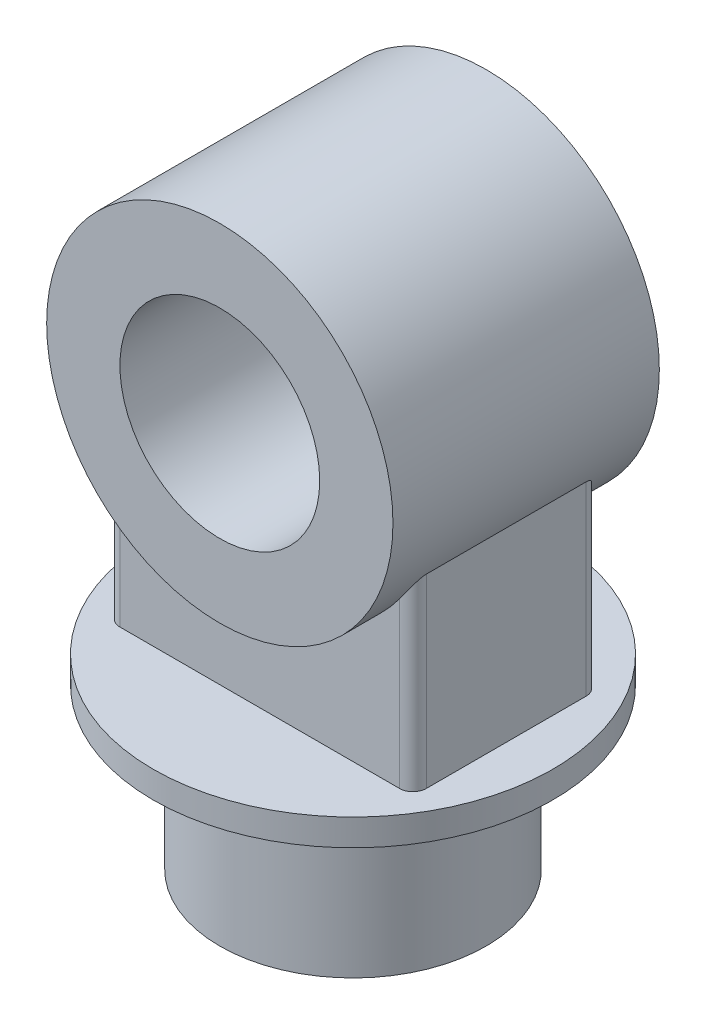
ISO-10303-21;
HEADER;
FILE_DESCRIPTION(('STEP AP214'),'2;1');
FILE_NAME('part.step','',(''),(''),'','','');
FILE_SCHEMA(('AUTOMOTIVE_DESIGN { 1 0 10303 214 1 1 1 1 }'));
ENDSEC;
DATA;
#1=APPLICATION_CONTEXT('core data for automotive mechanical design processes');
#2=APPLICATION_PROTOCOL_DEFINITION('international standard','automotive_design',2000,#1);
#3=PRODUCT_CONTEXT('',#1,'mechanical');
#4=PRODUCT('Part','Part','',(#3));
#5=PRODUCT_RELATED_PRODUCT_CATEGORY('part','',(#4));
#6=PRODUCT_DEFINITION_FORMATION('','',#4);
#7=PRODUCT_DEFINITION_CONTEXT('part definition',#1,'design');
#8=PRODUCT_DEFINITION('design','',#6,#7);
#9=PRODUCT_DEFINITION_SHAPE('','',#8);
#10=(LENGTH_UNIT() NAMED_UNIT(*) SI_UNIT(.MILLI.,.METRE.));
#11=(NAMED_UNIT(*) PLANE_ANGLE_UNIT() SI_UNIT($,.RADIAN.));
#12=(NAMED_UNIT(*) SI_UNIT($,.STERADIAN.) SOLID_ANGLE_UNIT());
#13=UNCERTAINTY_MEASURE_WITH_UNIT(LENGTH_MEASURE(1.E-05),#10,'distance_accuracy_value','');
#14=(GEOMETRIC_REPRESENTATION_CONTEXT(3) GLOBAL_UNCERTAINTY_ASSIGNED_CONTEXT((#13)) GLOBAL_UNIT_ASSIGNED_CONTEXT((#10,
#11,#12)) REPRESENTATION_CONTEXT('',''));
#15=CARTESIAN_POINT('',(0.,0.,0.));
#16=DIRECTION('',(0.,0.,1.));
#17=DIRECTION('',(1.,0.,0.));
#18=AXIS2_PLACEMENT_3D('',#15,#16,#17);
#19=CARTESIAN_POINT('',(0.,120.,0.));
#20=DIRECTION('',(0.,-1.,0.));
#21=DIRECTION('',(0.,0.,-1.));
#22=AXIS2_PLACEMENT_3D('',#19,#20,#21);
#23=CYLINDRICAL_SURFACE('',#22,100.);
#24=CARTESIAN_POINT('',(0.,120.,0.));
#25=DIRECTION('',(0.,1.,0.));
#26=DIRECTION('',(0.,0.,1.));
#27=AXIS2_PLACEMENT_3D('',#24,#25,#26);
#28=CIRCLE('',#27,100.);
#29=CARTESIAN_POINT('',(0.,120.,100.));
#30=VERTEX_POINT('',#29);
#31=EDGE_CURVE('E147',#30,#30,#28,.T.);
#32=ORIENTED_EDGE('',*,*,#31,.F.);
#33=EDGE_LOOP('',(#32));
#34=FACE_BOUND('',#33,.T.);
#35=CARTESIAN_POINT('',(0.,0.,0.));
#36=DIRECTION('',(0.,1.,0.));
#37=DIRECTION('',(0.,0.,1.));
#38=AXIS2_PLACEMENT_3D('',#35,#36,#37);
#39=CIRCLE('',#38,100.);
#40=CARTESIAN_POINT('',(0.,0.,100.));
#41=VERTEX_POINT('',#40);
#42=EDGE_CURVE('E239',#41,#41,#39,.T.);
#43=ORIENTED_EDGE('',*,*,#42,.T.);
#44=EDGE_LOOP('',(#43));
#45=FACE_BOUND('',#44,.T.);
#46=ADVANCED_FACE('F39',(#34,#45),#23,.T.);
#47=CARTESIAN_POINT('',(0.,0.,0.));
#48=DIRECTION('',(0.,1.,0.));
#49=DIRECTION('',(0.,0.,1.));
#50=AXIS2_PLACEMENT_3D('',#47,#48,#49);
#51=PLANE('',#50);
#52=ORIENTED_EDGE('',*,*,#42,.F.);
#53=EDGE_LOOP('',(#52));
#54=FACE_BOUND('',#53,.T.);
#55=ADVANCED_FACE('F251',(#54),#51,.F.);
#56=CARTESIAN_POINT('',(0.,140.,0.));
#57=DIRECTION('',(0.,-1.,0.));
#58=DIRECTION('',(0.,0.,-1.));
#59=AXIS2_PLACEMENT_3D('',#56,#57,#58);
#60=CYLINDRICAL_SURFACE('',#59,150.);
#61=CARTESIAN_POINT('',(0.,140.,0.));
#62=DIRECTION('',(0.,1.,0.));
#63=DIRECTION('',(0.,0.,1.));
#64=AXIS2_PLACEMENT_3D('',#61,#62,#63);
#65=CIRCLE('',#64,150.);
#66=CARTESIAN_POINT('',(0.,140.,150.));
#67=VERTEX_POINT('',#66);
#68=EDGE_CURVE('E235',#67,#67,#65,.T.);
#69=ORIENTED_EDGE('',*,*,#68,.F.);
#70=EDGE_LOOP('',(#69));
#71=FACE_BOUND('',#70,.T.);
#72=CARTESIAN_POINT('',(0.,120.,0.));
#73=DIRECTION('',(0.,1.,0.));
#74=DIRECTION('',(0.,0.,1.));
#75=AXIS2_PLACEMENT_3D('',#72,#73,#74);
#76=CIRCLE('',#75,150.);
#77=CARTESIAN_POINT('',(0.,120.,150.));
#78=VERTEX_POINT('',#77);
#79=EDGE_CURVE('E240',#78,#78,#76,.T.);
#80=ORIENTED_EDGE('',*,*,#79,.T.);
#81=EDGE_LOOP('',(#80));
#82=FACE_BOUND('',#81,.T.);
#83=ADVANCED_FACE('F253',(#71,#82),#60,.T.);
#84=CARTESIAN_POINT('',(0.,140.,0.));
#85=DIRECTION('',(0.,1.,0.));
#86=DIRECTION('',(0.,0.,1.));
#87=AXIS2_PLACEMENT_3D('',#84,#85,#86);
#88=PLANE('',#87);
#89=DIRECTION('',(0.,0.,-1.));
#90=VECTOR('',#89,1.);
#91=CARTESIAN_POINT('',(115.,140.,70.));
#92=LINE('',#91,#90);
#93=CARTESIAN_POINT('',(115.,140.,60.));
#94=VERTEX_POINT('',#93);
#95=CARTESIAN_POINT('',(115.,140.,-60.));
#96=VERTEX_POINT('',#95);
#97=EDGE_CURVE('E210',#94,#96,#92,.T.);
#98=ORIENTED_EDGE('',*,*,#97,.F.);
#99=CARTESIAN_POINT('',(105.,140.,60.));
#100=DIRECTION('',(0.,1.,0.));
#101=DIRECTION('',(0.,0.,1.));
#102=AXIS2_PLACEMENT_3D('',#99,#100,#101);
#103=CIRCLE('',#102,10.);
#104=CARTESIAN_POINT('',(105.,140.,70.));
#105=VERTEX_POINT('',#104);
#106=EDGE_CURVE('E54',#94,#105,#103,.F.);
#107=ORIENTED_EDGE('',*,*,#106,.T.);
#108=DIRECTION('',(1.,0.,0.));
#109=VECTOR('',#108,1.);
#110=CARTESIAN_POINT('',(-115.,140.,70.));
#111=LINE('',#110,#109);
#112=CARTESIAN_POINT('',(-105.,140.,70.));
#113=VERTEX_POINT('',#112);
#114=EDGE_CURVE('E209',#113,#105,#111,.T.);
#115=ORIENTED_EDGE('',*,*,#114,.F.);
#116=CARTESIAN_POINT('',(-105.,140.,60.));
#117=DIRECTION('',(0.,1.,0.));
#118=DIRECTION('',(0.,0.,1.));
#119=AXIS2_PLACEMENT_3D('',#116,#117,#118);
#120=CIRCLE('',#119,10.);
#121=CARTESIAN_POINT('',(-115.,140.,60.));
#122=VERTEX_POINT('',#121);
#123=EDGE_CURVE('E124',#113,#122,#120,.F.);
#124=ORIENTED_EDGE('',*,*,#123,.T.);
#125=DIRECTION('',(0.,0.,1.));
#126=VECTOR('',#125,1.);
#127=CARTESIAN_POINT('',(-115.,140.,70.));
#128=LINE('',#127,#126);
#129=CARTESIAN_POINT('',(-115.,140.,-60.));
#130=VERTEX_POINT('',#129);
#131=EDGE_CURVE('E216',#130,#122,#128,.T.);
#132=ORIENTED_EDGE('',*,*,#131,.F.);
#133=CARTESIAN_POINT('',(-105.,140.,-60.));
#134=DIRECTION('',(0.,1.,0.));
#135=DIRECTION('',(0.,0.,1.));
#136=AXIS2_PLACEMENT_3D('',#133,#134,#135);
#137=CIRCLE('',#136,10.);
#138=CARTESIAN_POINT('',(-105.,140.,-70.));
#139=VERTEX_POINT('',#138);
#140=EDGE_CURVE('E125',#130,#139,#137,.F.);
#141=ORIENTED_EDGE('',*,*,#140,.T.);
#142=DIRECTION('',(-1.,0.,0.));
#143=VECTOR('',#142,1.);
#144=CARTESIAN_POINT('',(-115.,140.,-70.));
#145=LINE('',#144,#143);
#146=CARTESIAN_POINT('',(105.,140.,-70.));
#147=VERTEX_POINT('',#146);
#148=EDGE_CURVE('E279',#147,#139,#145,.T.);
#149=ORIENTED_EDGE('',*,*,#148,.F.);
#150=CARTESIAN_POINT('',(105.,140.,-60.));
#151=DIRECTION('',(0.,1.,0.));
#152=DIRECTION('',(0.,0.,1.));
#153=AXIS2_PLACEMENT_3D('',#150,#151,#152);
#154=CIRCLE('',#153,10.);
#155=EDGE_CURVE('E61',#147,#96,#154,.F.);
#156=ORIENTED_EDGE('',*,*,#155,.T.);
#157=EDGE_LOOP('',(#98,#107,#115,#124,#132,#141,#149,#156));
#158=FACE_BOUND('',#157,.T.);
#159=ORIENTED_EDGE('',*,*,#68,.T.);
#160=EDGE_LOOP('',(#159));
#161=FACE_BOUND('',#160,.T.);
#162=ADVANCED_FACE('F207',(#158,#161),#88,.T.);
#163=CARTESIAN_POINT('',(0.,120.,0.));
#164=DIRECTION('',(0.,1.,0.));
#165=DIRECTION('',(0.,0.,1.));
#166=AXIS2_PLACEMENT_3D('',#163,#164,#165);
#167=PLANE('',#166);
#168=ORIENTED_EDGE('',*,*,#31,.T.);
#169=EDGE_LOOP('',(#168));
#170=FACE_BOUND('',#169,.T.);
#171=ORIENTED_EDGE('',*,*,#79,.F.);
#172=EDGE_LOOP('',(#171));
#173=FACE_BOUND('',#172,.T.);
#174=ADVANCED_FACE('F262',(#170,#173),#167,.F.);
#175=CARTESIAN_POINT('',(-115.,470.002,-70.));
#176=DIRECTION('',(0.,0.,1.));
#177=DIRECTION('',(1.,0.,0.));
#178=AXIS2_PLACEMENT_3D('',#175,#176,#177);
#179=PLANE('',#178);
#180=ORIENTED_EDGE('',*,*,#148,.T.);
#181=DIRECTION('',(0.,-1.,0.));
#182=VECTOR('',#181,1.);
#183=CARTESIAN_POINT('',(-105.,470.002,-70.));
#184=LINE('',#183,#182);
#185=CARTESIAN_POINT('',(-105.,263.351451416221,-70.));
#186=VERTEX_POINT('',#185);
#187=EDGE_CURVE('E145',#139,#186,#184,.F.);
#188=ORIENTED_EDGE('',*,*,#187,.T.);
#189=CARTESIAN_POINT('',(0.,340.,-70.));
#190=DIRECTION('',(0.,0.,1.));
#191=DIRECTION('',(1.,0.,0.));
#192=AXIS2_PLACEMENT_3D('',#189,#190,#191);
#193=CIRCLE('',#192,130.);
#194=CARTESIAN_POINT('',(105.,263.351451416221,-70.));
#195=VERTEX_POINT('',#194);
#196=EDGE_CURVE('E119',#195,#186,#193,.F.);
#197=ORIENTED_EDGE('',*,*,#196,.F.);
#198=DIRECTION('',(0.,-1.,0.));
#199=VECTOR('',#198,1.);
#200=CARTESIAN_POINT('',(105.,470.002,-70.));
#201=LINE('',#200,#199);
#202=EDGE_CURVE('E140',#195,#147,#201,.T.);
#203=ORIENTED_EDGE('',*,*,#202,.T.);
#204=EDGE_LOOP('',(#180,#188,#197,#203));
#205=FACE_BOUND('',#204,.T.);
#206=ADVANCED_FACE('F265',(#205),#179,.F.);
#207=CARTESIAN_POINT('',(115.,470.002,70.));
#208=DIRECTION('',(-1.,0.,0.));
#209=DIRECTION('',(0.,0.,1.));
#210=AXIS2_PLACEMENT_3D('',#207,#208,#209);
#211=PLANE('',#210);
#212=ORIENTED_EDGE('',*,*,#97,.T.);
#213=DIRECTION('',(0.,-1.,0.));
#214=VECTOR('',#213,1.);
#215=CARTESIAN_POINT('',(115.,470.002,-60.));
#216=LINE('',#215,#214);
#217=CARTESIAN_POINT('',(115.,279.378221735089,-60.));
#218=VERTEX_POINT('',#217);
#219=EDGE_CURVE('E163',#96,#218,#216,.F.);
#220=ORIENTED_EDGE('',*,*,#219,.T.);
#221=DIRECTION('',(0.,0.,-1.));
#222=VECTOR('',#221,1.);
#223=CARTESIAN_POINT('',(115.,279.378221735089,100.));
#224=LINE('',#223,#222);
#225=CARTESIAN_POINT('',(115.,279.378221735089,60.));
#226=VERTEX_POINT('',#225);
#227=EDGE_CURVE('E217',#226,#218,#224,.T.);
#228=ORIENTED_EDGE('',*,*,#227,.F.);
#229=DIRECTION('',(0.,-1.,0.));
#230=VECTOR('',#229,1.);
#231=CARTESIAN_POINT('',(115.,470.002,60.));
#232=LINE('',#231,#230);
#233=EDGE_CURVE('E160',#226,#94,#232,.T.);
#234=ORIENTED_EDGE('',*,*,#233,.T.);
#235=EDGE_LOOP('',(#212,#220,#228,#234));
#236=FACE_BOUND('',#235,.T.);
#237=ADVANCED_FACE('F224',(#236),#211,.F.);
#238=CARTESIAN_POINT('',(-115.,470.002,70.));
#239=DIRECTION('',(1.,0.,0.));
#240=DIRECTION('',(0.,0.,-1.));
#241=AXIS2_PLACEMENT_3D('',#238,#239,#240);
#242=PLANE('',#241);
#243=DIRECTION('',(0.,0.,-1.));
#244=VECTOR('',#243,1.);
#245=CARTESIAN_POINT('',(-115.,279.378221735089,100.));
#246=LINE('',#245,#244);
#247=CARTESIAN_POINT('',(-115.,279.378221735089,-60.));
#248=VERTEX_POINT('',#247);
#249=CARTESIAN_POINT('',(-115.,279.378221735089,60.));
#250=VERTEX_POINT('',#249);
#251=EDGE_CURVE('E116',#248,#250,#246,.F.);
#252=ORIENTED_EDGE('',*,*,#251,.F.);
#253=DIRECTION('',(0.,-1.,0.));
#254=VECTOR('',#253,1.);
#255=CARTESIAN_POINT('',(-115.,470.002,-60.));
#256=LINE('',#255,#254);
#257=EDGE_CURVE('E131',#248,#130,#256,.T.);
#258=ORIENTED_EDGE('',*,*,#257,.T.);
#259=ORIENTED_EDGE('',*,*,#131,.T.);
#260=DIRECTION('',(0.,-1.,0.));
#261=VECTOR('',#260,1.);
#262=CARTESIAN_POINT('',(-115.,470.002,60.));
#263=LINE('',#262,#261);
#264=EDGE_CURVE('E134',#122,#250,#263,.F.);
#265=ORIENTED_EDGE('',*,*,#264,.T.);
#266=EDGE_LOOP('',(#252,#258,#259,#265));
#267=FACE_BOUND('',#266,.T.);
#268=ADVANCED_FACE('F129',(#267),#242,.F.);
#269=CARTESIAN_POINT('',(-115.,470.002,70.));
#270=DIRECTION('',(0.,0.,-1.));
#271=DIRECTION('',(-1.,0.,0.));
#272=AXIS2_PLACEMENT_3D('',#269,#270,#271);
#273=PLANE('',#272);
#274=CARTESIAN_POINT('',(0.,340.,70.));
#275=DIRECTION('',(0.,0.,-1.));
#276=DIRECTION('',(-1.,0.,0.));
#277=AXIS2_PLACEMENT_3D('',#274,#275,#276);
#278=CIRCLE('',#277,130.);
#279=CARTESIAN_POINT('',(-105.,263.351451416221,70.));
#280=VERTEX_POINT('',#279);
#281=CARTESIAN_POINT('',(105.,263.351451416221,70.));
#282=VERTEX_POINT('',#281);
#283=EDGE_CURVE('E136',#280,#282,#278,.F.);
#284=ORIENTED_EDGE('',*,*,#283,.F.);
#285=DIRECTION('',(0.,-1.,0.));
#286=VECTOR('',#285,1.);
#287=CARTESIAN_POINT('',(-105.,470.002,70.));
#288=LINE('',#287,#286);
#289=EDGE_CURVE('E156',#280,#113,#288,.T.);
#290=ORIENTED_EDGE('',*,*,#289,.T.);
#291=ORIENTED_EDGE('',*,*,#114,.T.);
#292=DIRECTION('',(0.,-1.,0.));
#293=VECTOR('',#292,1.);
#294=CARTESIAN_POINT('',(105.,470.002,70.));
#295=LINE('',#294,#293);
#296=EDGE_CURVE('E153',#105,#282,#295,.F.);
#297=ORIENTED_EDGE('',*,*,#296,.T.);
#298=EDGE_LOOP('',(#284,#290,#291,#297));
#299=FACE_BOUND('',#298,.T.);
#300=ADVANCED_FACE('F213',(#299),#273,.F.);
#301=CARTESIAN_POINT('',(0.,340.,100.));
#302=DIRECTION('',(0.,0.,-1.));
#303=DIRECTION('',(-1.,0.,0.));
#304=AXIS2_PLACEMENT_3D('',#301,#302,#303);
#305=CYLINDRICAL_SURFACE('',#304,130.);
#306=CARTESIAN_POINT('',(0.,340.,100.));
#307=DIRECTION('',(0.,0.,1.));
#308=DIRECTION('',(1.,0.,0.));
#309=AXIS2_PLACEMENT_3D('',#306,#307,#308);
#310=CIRCLE('',#309,130.);
#311=CARTESIAN_POINT('',(130.,340.,100.));
#312=VERTEX_POINT('',#311);
#313=EDGE_CURVE('E234',#312,#312,#310,.T.);
#314=ORIENTED_EDGE('',*,*,#313,.F.);
#315=EDGE_LOOP('',(#314));
#316=FACE_BOUND('',#315,.T.);
#317=CARTESIAN_POINT('',(0.,340.,-100.));
#318=DIRECTION('',(0.,0.,1.));
#319=DIRECTION('',(1.,0.,0.));
#320=AXIS2_PLACEMENT_3D('',#317,#318,#319);
#321=CIRCLE('',#320,130.);
#322=CARTESIAN_POINT('',(130.,340.,-100.));
#323=VERTEX_POINT('',#322);
#324=EDGE_CURVE('E287',#323,#323,#321,.T.);
#325=ORIENTED_EDGE('',*,*,#324,.T.);
#326=EDGE_LOOP('',(#325));
#327=FACE_BOUND('',#326,.T.);
#328=ORIENTED_EDGE('',*,*,#283,.T.);
#329=CARTESIAN_POINT('',(105.,263.351451416221,70.));
#330=CARTESIAN_POINT('',(105.244023548551,263.685728523521,69.9999723256598));
#331=CARTESIAN_POINT('',(105.48642946656,264.021157559598,69.9910676934993));
#332=CARTESIAN_POINT('',(105.967594448345,264.693695217549,69.9560076420119));
#333=CARTESIAN_POINT('',(106.206353756808,265.0308037247,69.9298533853854));
#334=CARTESIAN_POINT('',(106.680121297863,265.706512595677,69.8607570587378));
#335=CARTESIAN_POINT('',(106.915124862554,266.045114235681,69.8177955680095));
#336=CARTESIAN_POINT('',(107.38075659442,266.722840371416,69.7153916401701));
#337=CARTESIAN_POINT('',(107.6113846855,267.061964876129,69.6559489167159));
#338=CARTESIAN_POINT('',(108.069209890109,267.742025782065,69.5203606094133));
#339=CARTESIAN_POINT('',(108.296380598874,268.082961708561,69.4441234635876));
#340=CARTESIAN_POINT('',(108.745628468872,268.764091064228,69.2751208665269));
#341=CARTESIAN_POINT('',(108.967705679542,269.104284500576,69.1823555757875));
#342=CARTESIAN_POINT('',(109.406285418763,269.78299455667,68.9801407587527));
#343=CARTESIAN_POINT('',(109.622791313465,270.121512084138,68.8707015971689));
#344=CARTESIAN_POINT('',(110.04995594647,270.796195328777,68.6346678775713));
#345=CARTESIAN_POINT('',(110.260615436595,271.132361344144,68.5080755378149));
#346=CARTESIAN_POINT('',(110.675896846479,271.801751067569,68.2368550140419));
#347=CARTESIAN_POINT('',(110.880511519469,272.134970933169,68.0922061883122));
#348=CARTESIAN_POINT('',(111.282861577694,272.796766125069,67.7839506173463));
#349=CARTESIAN_POINT('',(111.480597405697,273.12534174949,67.6203450952319));
#350=CARTESIAN_POINT('',(111.868425371471,273.776145770139,67.2727268139584));
#351=CARTESIAN_POINT('',(112.058518187616,274.098374728379,67.0887158713999));
#352=CARTESIAN_POINT('',(112.430016568141,274.734183567107,66.6983200924537));
#353=CARTESIAN_POINT('',(112.611423895221,275.047765197026,66.4919398238547));
#354=CARTESIAN_POINT('',(112.920473011924,275.586972469132,66.1082598784734));
#355=CARTESIAN_POINT('',(113.050322950768,275.815183611497,65.9363774103935));
#356=CARTESIAN_POINT('',(113.303376082384,276.262953777002,65.5769421780839));
#357=CARTESIAN_POINT('',(113.426578007138,276.482511147417,65.389386441658));
#358=CARTESIAN_POINT('',(113.664731893403,276.909681161859,64.9974863402015));
#359=CARTESIAN_POINT('',(113.77970552177,277.117324867522,64.7931893533143));
#360=CARTESIAN_POINT('',(113.999957555807,277.517508166604,64.3656086541486));
#361=CARTESIAN_POINT('',(114.1052428526,277.710058480989,64.1423386578589));
#362=CARTESIAN_POINT('',(114.312151440425,278.090528167509,63.6551006642549));
#363=CARTESIAN_POINT('',(114.412719585974,278.276691861399,63.3892887456522));
#364=CARTESIAN_POINT('',(114.595430697859,278.616577601129,62.8308577548973));
#365=CARTESIAN_POINT('',(114.677563932758,278.770282510073,62.5382246385914));
#366=CARTESIAN_POINT('',(114.782964477152,278.968230850553,62.07820580454));
#367=CARTESIAN_POINT('',(114.815319068335,279.029135743556,61.9199842839799));
#368=CARTESIAN_POINT('',(114.872875621763,279.137645387196,61.5978261012162));
#369=CARTESIAN_POINT('',(114.898082304741,279.185258915595,61.4338932916677));
#370=CARTESIAN_POINT('',(114.940500687085,279.265468078633,61.1019744434488));
#371=CARTESIAN_POINT('',(114.957739706971,279.298115029371,60.934004364722));
#372=CARTESIAN_POINT('',(114.983714948384,279.347332394128,60.5951739623295));
#373=CARTESIAN_POINT('',(114.992460290621,279.363920052928,60.4243169398346));
#374=CARTESIAN_POINT('',(114.99786519081,279.374172172471,60.21090261056));
#375=CARTESIAN_POINT('',(114.998665669105,279.375690576175,60.1687298235098));
#376=CARTESIAN_POINT('',(114.999732735445,279.377714703023,60.0843734319031));
#377=CARTESIAN_POINT('',(114.999999579261,279.378220911313,60.0421898422257));
#378=CARTESIAN_POINT('',(115.,279.378221735089,60.));
#379=B_SPLINE_CURVE_WITH_KNOTS('',3,(#329,#330,#331,#332,#333,#334,#335,#336,#337,#338,#339,
#340,#341,#342,#343,#344,#345,#346,#347,#348,#349,#350,#351,#352,#353,#354,#355,#356,#357,#358,
#359,#360,#361,#362,#363,#364,#365,#366,#367,#368,#369,#370,#371,#372,#373,#374,#375,#376,#377,
#378),.UNSPECIFIED.,.F.,.F.,(4,2,2,2,2,2,2,2,2,2,2,2,2,2,2,2,2,2,2,2,2,2,2,2,4),(0.,
1.24147771074381,2.48287174900145,3.72570447121818,4.96855878761307,6.21836456996588,
7.46815821681542,8.71717812043939,9.96603665407722,11.2163361546491,12.4665550284216,
13.7166626901958,14.9665155607466,15.907499415771,16.8486621207328,17.787247666531,
18.7251603691789,19.7420615311754,20.759498240032,21.2766690857998,21.7934975739193,
22.3085405026267,22.8230297527066,22.9496436159209,23.07619677853),.UNSPECIFIED.);
#380=EDGE_CURVE('E11',#282,#226,#379,.T.);
#381=ORIENTED_EDGE('',*,*,#380,.T.);
#382=ORIENTED_EDGE('',*,*,#227,.T.);
#383=CARTESIAN_POINT('',(115.,279.378221735089,-60.));
#384=CARTESIAN_POINT('',(115.000029274986,279.37828163891,-60.1438419540229));
#385=CARTESIAN_POINT('',(114.996897628447,279.372336579825,-60.2876485996431));
#386=CARTESIAN_POINT('',(114.984537728095,279.348896146285,-60.5738857890051));
#387=CARTESIAN_POINT('',(114.975316773243,279.331414600082,-60.7163177733584));
#388=CARTESIAN_POINT('',(114.951144412366,279.285627585531,-60.9972008979145));
#389=CARTESIAN_POINT('',(114.93626114966,279.257450838014,-61.1356790983657));
#390=CARTESIAN_POINT('',(114.901126084712,279.19101511427,-61.4095257494584));
#391=CARTESIAN_POINT('',(114.880872422684,279.152752645355,-61.5448931051241));
#392=CARTESIAN_POINT('',(114.829547045394,279.055936735111,-61.8463587178536));
#393=CARTESIAN_POINT('',(114.797032206608,278.994694785489,-62.011349418753));
#394=CARTESIAN_POINT('',(114.725087134123,278.859504085935,-62.334551695646));
#395=CARTESIAN_POINT('',(114.685651727062,278.785545830974,-62.4927580892648));
#396=CARTESIAN_POINT('',(114.600586843173,278.626441694782,-62.802617475325));
#397=CARTESIAN_POINT('',(114.554930265094,278.541246919128,-62.9542377375681));
#398=CARTESIAN_POINT('',(114.458393560477,278.361647061429,-63.2500766569091));
#399=CARTESIAN_POINT('',(114.407514566505,278.267243976573,-63.3942969086855));
#400=CARTESIAN_POINT('',(114.267934151141,278.009096343206,-63.763671509766));
#401=CARTESIAN_POINT('',(114.175499418946,277.838948294073,-63.9829538534177));
#402=CARTESIAN_POINT('',(113.981040682834,277.483093714356,-64.4039437616031));
#403=CARTESIAN_POINT('',(113.879010341081,277.297376909632,-64.6056395384488));
#404=CARTESIAN_POINT('',(113.667004247985,276.913866658294,-64.9931818513624));
#405=CARTESIAN_POINT('',(113.557018746917,276.716058440209,-65.179008308818));
#406=CARTESIAN_POINT('',(113.330452100792,276.31120601246,-65.5360898421736));
#407=CARTESIAN_POINT('',(113.213868477332,276.104158338509,-65.7073393813631));
#408=CARTESIAN_POINT('',(112.981140023387,275.69358630689,-66.0281541198065));
#409=CARTESIAN_POINT('',(112.865273410344,275.490416739472,-66.1783788175742));
#410=CARTESIAN_POINT('',(112.629087078109,275.07893237789,-66.4677586582276));
#411=CARTESIAN_POINT('',(112.508768026405,274.870618356503,-66.6069154505891));
#412=CARTESIAN_POINT('',(112.264024442805,274.449651900806,-66.8750948847412));
#413=CARTESIAN_POINT('',(112.139596778704,274.236996206063,-67.004109528956));
#414=CARTESIAN_POINT('',(111.887075206485,273.808275802651,-67.2525546326278));
#415=CARTESIAN_POINT('',(111.758980876244,273.592210702772,-67.3719839825108));
#416=CARTESIAN_POINT('',(111.368845649611,272.938550831032,-67.7174410265371));
#417=CARTESIAN_POINT('',(111.101686481089,272.496755806556,-67.9298442820832));
#418=CARTESIAN_POINT('',(110.555628082397,271.606095950998,-68.3215254207164));
#419=CARTESIAN_POINT('',(110.276731380445,271.157232655299,-68.5008103929627));
#420=CARTESIAN_POINT('',(109.799683538227,270.399996306998,-68.7756775079479));
#421=CARTESIAN_POINT('',(109.60438780231,270.092832698261,-68.8796427468412));
#422=CARTESIAN_POINT('',(109.20918911923,269.477047474121,-69.0736539378895));
#423=CARTESIAN_POINT('',(109.009285942206,269.168425786589,-69.1636991938527));
#424=CARTESIAN_POINT('',(108.605098865995,268.550234872762,-69.3301144743326));
#425=CARTESIAN_POINT('',(108.400813681192,268.240665391882,-69.4064804223574));
#426=CARTESIAN_POINT('',(107.988170258149,267.621179944963,-69.5455876501021));
#427=CARTESIAN_POINT('',(107.77981201624,267.311263978612,-69.6083289175467));
#428=CARTESIAN_POINT('',(107.36211774401,266.695756447818,-69.719386079876));
#429=CARTESIAN_POINT('',(107.152833135219,266.390163138302,-69.767885760367));
#430=CARTESIAN_POINT('',(106.730790235418,265.779543437627,-69.851427925795));
#431=CARTESIAN_POINT('',(106.518032014326,265.474517035196,-69.8864706812544));
#432=CARTESIAN_POINT('',(106.089413080041,264.865620975843,-69.9428316278814));
#433=CARTESIAN_POINT('',(105.873554122088,264.561750778802,-69.9641572934039));
#434=CARTESIAN_POINT('',(105.438901328298,263.955424546064,-69.9927327619326));
#435=CARTESIAN_POINT('',(105.220107306888,263.65296860143,-69.9999816706571));
#436=CARTESIAN_POINT('',(105.,263.351451416221,-70.));
#437=B_SPLINE_CURVE_WITH_KNOTS('',3,(#383,#384,#385,#386,#387,#388,#389,#390,#391,#392,#393,
#394,#395,#396,#397,#398,#399,#400,#401,#402,#403,#404,#405,#406,#407,#408,#409,#410,#411,#412,
#413,#414,#415,#416,#417,#418,#419,#420,#421,#422,#423,#424,#425,#426,#427,#428,#429,#430,#431,
#432,#433,#434,#435,#436),.UNSPECIFIED.,.F.,.F.,(4,2,2,2,2,2,2,2,2,2,2,2,2,2,2,2,2,2,2,2,2,2,2,
2,2,2,4),(0.,0.431312668060816,0.862109278463096,1.28787753870408,1.71379343672951,
2.24987304263885,2.78635510677466,3.32525377538739,3.86403582108508,4.74020514904741,
5.61695730065091,6.49480281421268,7.37298028326476,8.20657346483489,9.0400421803735,
9.87416166783109,10.7083775724082,12.3817870426617,14.0548378938534,15.1902115086109,
16.3256418894101,17.4614100724101,18.5971792786807,19.7175729794268,20.8379441559059,
21.9577043309504,23.0775356408654),.UNSPECIFIED.);
#438=EDGE_CURVE('E198',#218,#195,#437,.T.);
#439=ORIENTED_EDGE('',*,*,#438,.T.);
#440=ORIENTED_EDGE('',*,*,#196,.T.);
#441=CARTESIAN_POINT('',(-105.,263.351451416221,-70.));
#442=CARTESIAN_POINT('',(-105.24402354855,263.685728523521,-69.9999723256598));
#443=CARTESIAN_POINT('',(-105.48642946656,264.021157559598,-69.9910676934993));
#444=CARTESIAN_POINT('',(-105.967594448345,264.693695217549,-69.9560076420119));
#445=CARTESIAN_POINT('',(-106.206353756808,265.0308037247,-69.9298533853854));
#446=CARTESIAN_POINT('',(-106.680121297863,265.706512595677,-69.8607570587378));
#447=CARTESIAN_POINT('',(-106.915124862554,266.045114235681,-69.8177955680095));
#448=CARTESIAN_POINT('',(-107.38075659442,266.722840371416,-69.7153916401701));
#449=CARTESIAN_POINT('',(-107.6113846855,267.061964876129,-69.6559489167159));
#450=CARTESIAN_POINT('',(-108.069209890109,267.742025782065,-69.5203606094133));
#451=CARTESIAN_POINT('',(-108.296380598874,268.082961708561,-69.4441234635876));
#452=CARTESIAN_POINT('',(-108.745628468872,268.764091064228,-69.2751208665269));
#453=CARTESIAN_POINT('',(-108.967705679542,269.104284500576,-69.1823555757875));
#454=CARTESIAN_POINT('',(-109.406285418763,269.78299455667,-68.9801407587527));
#455=CARTESIAN_POINT('',(-109.622791313465,270.121512084138,-68.8707015971689));
#456=CARTESIAN_POINT('',(-110.04995594647,270.796195328776,-68.6346678775713));
#457=CARTESIAN_POINT('',(-110.260615436595,271.132361344144,-68.5080755378149));
#458=CARTESIAN_POINT('',(-110.675896846479,271.801751067569,-68.2368550140419));
#459=CARTESIAN_POINT('',(-110.880511519469,272.134970933169,-68.0922061883122));
#460=CARTESIAN_POINT('',(-111.282861577694,272.796766125069,-67.7839506173464));
#461=CARTESIAN_POINT('',(-111.480597405697,273.12534174949,-67.6203450952319));
#462=CARTESIAN_POINT('',(-111.868425371471,273.776145770139,-67.2727268139584));
#463=CARTESIAN_POINT('',(-112.058518187616,274.098374728379,-67.0887158713999));
#464=CARTESIAN_POINT('',(-112.430016568141,274.734183567107,-66.6983200924537));
#465=CARTESIAN_POINT('',(-112.611423895221,275.047765197026,-66.4919398238546));
#466=CARTESIAN_POINT('',(-112.920473011924,275.586972469132,-66.1082598784734));
#467=CARTESIAN_POINT('',(-113.050322950768,275.815183611497,-65.9363774103934));
#468=CARTESIAN_POINT('',(-113.303376082384,276.262953777002,-65.5769421780839));
#469=CARTESIAN_POINT('',(-113.426578007138,276.482511147417,-65.3893864416581));
#470=CARTESIAN_POINT('',(-113.664731893403,276.909681161859,-64.9974863402015));
#471=CARTESIAN_POINT('',(-113.77970552177,277.117324867522,-64.7931893533143));
#472=CARTESIAN_POINT('',(-113.999957555807,277.517508166604,-64.3656086541486));
#473=CARTESIAN_POINT('',(-114.1052428526,277.710058480989,-64.142338657859));
#474=CARTESIAN_POINT('',(-114.312151440425,278.090528167509,-63.6551006642549));
#475=CARTESIAN_POINT('',(-114.412719585974,278.276691861399,-63.3892887456521));
#476=CARTESIAN_POINT('',(-114.595430697859,278.616577601129,-62.8308577548973));
#477=CARTESIAN_POINT('',(-114.677563932758,278.770282510073,-62.5382246385914));
#478=CARTESIAN_POINT('',(-114.782964477152,278.968230850553,-62.07820580454));
#479=CARTESIAN_POINT('',(-114.815319068335,279.029135743556,-61.91998428398));
#480=CARTESIAN_POINT('',(-114.872875621763,279.137645387196,-61.5978261012162));
#481=CARTESIAN_POINT('',(-114.898082304741,279.185258915595,-61.4338932916677));
#482=CARTESIAN_POINT('',(-114.940500687085,279.265468078633,-61.1019744434488));
#483=CARTESIAN_POINT('',(-114.957739706971,279.298115029371,-60.934004364722));
#484=CARTESIAN_POINT('',(-114.983714948384,279.347332394128,-60.5951739623294));
#485=CARTESIAN_POINT('',(-114.992460290621,279.363920052928,-60.4243169398346));
#486=CARTESIAN_POINT('',(-114.99786519081,279.374172172471,-60.21090261056));
#487=CARTESIAN_POINT('',(-114.998665669105,279.375690576175,-60.1687298235098));
#488=CARTESIAN_POINT('',(-114.999732735445,279.377714703023,-60.0843734319031));
#489=CARTESIAN_POINT('',(-114.999999579261,279.378220911313,-60.0421898422257));
#490=CARTESIAN_POINT('',(-115.,279.378221735089,-60.));
#491=B_SPLINE_CURVE_WITH_KNOTS('',3,(#441,#442,#443,#444,#445,#446,#447,#448,#449,#450,#451,
#452,#453,#454,#455,#456,#457,#458,#459,#460,#461,#462,#463,#464,#465,#466,#467,#468,#469,#470,
#471,#472,#473,#474,#475,#476,#477,#478,#479,#480,#481,#482,#483,#484,#485,#486,#487,#488,#489,
#490),.UNSPECIFIED.,.F.,.F.,(4,2,2,2,2,2,2,2,2,2,2,2,2,2,2,2,2,2,2,2,2,2,2,2,4),(0.,
1.24147771074382,2.48287174900147,3.7257044712182,4.9685587876131,6.2183645699659,
7.46815821681538,8.71717812043932,9.96603665407716,11.216336154649,12.4665550284216,
13.7166626901958,14.9665155607466,15.907499415771,16.8486621207327,17.787247666531,
18.7251603691788,19.7420615311753,20.7594982400319,21.2766690857998,21.7934975739192,
22.3085405026266,22.8230297527065,22.9496436159209,23.0761967785299),.UNSPECIFIED.);
#492=EDGE_CURVE('E112',#186,#248,#491,.T.);
#493=ORIENTED_EDGE('',*,*,#492,.T.);
#494=ORIENTED_EDGE('',*,*,#251,.T.);
#495=CARTESIAN_POINT('',(-115.,279.378221735089,60.));
#496=CARTESIAN_POINT('',(-115.000029274986,279.37828163891,60.1438419540229));
#497=CARTESIAN_POINT('',(-114.996897628447,279.372336579824,60.287648599643));
#498=CARTESIAN_POINT('',(-114.984537728095,279.348896146285,60.573885789005));
#499=CARTESIAN_POINT('',(-114.975316773243,279.331414600082,60.7163177733584));
#500=CARTESIAN_POINT('',(-114.951144412366,279.285627585531,60.9972008979145));
#501=CARTESIAN_POINT('',(-114.93626114966,279.257450838014,61.1356790983657));
#502=CARTESIAN_POINT('',(-114.901126084712,279.19101511427,61.4095257494583));
#503=CARTESIAN_POINT('',(-114.880872422684,279.152752645355,61.5448931051241));
#504=CARTESIAN_POINT('',(-114.829547045394,279.055936735111,61.8463587178536));
#505=CARTESIAN_POINT('',(-114.797032206608,278.994694785489,62.011349418753));
#506=CARTESIAN_POINT('',(-114.725087134123,278.859504085935,62.3345516956459));
#507=CARTESIAN_POINT('',(-114.685651727062,278.785545830974,62.4927580892648));
#508=CARTESIAN_POINT('',(-114.600586843173,278.626441694782,62.802617475325));
#509=CARTESIAN_POINT('',(-114.554930265094,278.541246919128,62.9542377375681));
#510=CARTESIAN_POINT('',(-114.458393560477,278.361647061429,63.2500766569091));
#511=CARTESIAN_POINT('',(-114.407514566504,278.267243976573,63.3942969086855));
#512=CARTESIAN_POINT('',(-114.267934151141,278.009096343206,63.763671509766));
#513=CARTESIAN_POINT('',(-114.175499418946,277.838948294073,63.9829538534177));
#514=CARTESIAN_POINT('',(-113.981040682834,277.483093714356,64.4039437616031));
#515=CARTESIAN_POINT('',(-113.879010341081,277.297376909632,64.6056395384488));
#516=CARTESIAN_POINT('',(-113.667004247985,276.913866658294,64.9931818513625));
#517=CARTESIAN_POINT('',(-113.557018746917,276.716058440209,65.179008308818));
#518=CARTESIAN_POINT('',(-113.330452100792,276.311206012459,65.5360898421737));
#519=CARTESIAN_POINT('',(-113.213868477332,276.104158338509,65.7073393813631));
#520=CARTESIAN_POINT('',(-112.981140023387,275.69358630689,66.0281541198065));
#521=CARTESIAN_POINT('',(-112.865273410344,275.490416739472,66.1783788175742));
#522=CARTESIAN_POINT('',(-112.629087078109,275.07893237789,66.4677586582276));
#523=CARTESIAN_POINT('',(-112.508768026405,274.870618356503,66.6069154505891));
#524=CARTESIAN_POINT('',(-112.264024442805,274.449651900806,66.8750948847412));
#525=CARTESIAN_POINT('',(-112.139596778703,274.236996206062,67.004109528956));
#526=CARTESIAN_POINT('',(-111.887075206485,273.808275802651,67.2525546326279));
#527=CARTESIAN_POINT('',(-111.758980876244,273.592210702771,67.3719839825108));
#528=CARTESIAN_POINT('',(-111.368845649611,272.938550831032,67.7174410265371));
#529=CARTESIAN_POINT('',(-111.101686481089,272.496755806555,67.9298442820832));
#530=CARTESIAN_POINT('',(-110.555628082397,271.606095950998,68.3215254207164));
#531=CARTESIAN_POINT('',(-110.276731380444,271.157232655298,68.5008103929627));
#532=CARTESIAN_POINT('',(-109.799683538227,270.399996306997,68.7756775079479));
#533=CARTESIAN_POINT('',(-109.604387802309,270.092832698261,68.8796427468412));
#534=CARTESIAN_POINT('',(-109.20918911923,269.477047474121,69.0736539378895));
#535=CARTESIAN_POINT('',(-109.009285942206,269.168425786589,69.1636991938527));
#536=CARTESIAN_POINT('',(-108.605098865995,268.550234872762,69.3301144743326));
#537=CARTESIAN_POINT('',(-108.400813681192,268.240665391882,69.4064804223574));
#538=CARTESIAN_POINT('',(-107.988170258149,267.621179944962,69.5455876501021));
#539=CARTESIAN_POINT('',(-107.77981201624,267.311263978612,69.6083289175467));
#540=CARTESIAN_POINT('',(-107.36211774401,266.695756447818,69.719386079876));
#541=CARTESIAN_POINT('',(-107.152833135219,266.390163138302,69.767885760367));
#542=CARTESIAN_POINT('',(-106.730790235418,265.779543437627,69.851427925795));
#543=CARTESIAN_POINT('',(-106.518032014326,265.474517035196,69.8864706812544));
#544=CARTESIAN_POINT('',(-106.089413080041,264.865620975843,69.9428316278814));
#545=CARTESIAN_POINT('',(-105.873554122088,264.561750778802,69.9641572934039));
#546=CARTESIAN_POINT('',(-105.438901328298,263.955424546064,69.9927327619326));
#547=CARTESIAN_POINT('',(-105.220107306888,263.65296860143,69.9999816706571));
#548=CARTESIAN_POINT('',(-105.,263.351451416221,70.));
#549=B_SPLINE_CURVE_WITH_KNOTS('',3,(#495,#496,#497,#498,#499,#500,#501,#502,#503,#504,#505,
#506,#507,#508,#509,#510,#511,#512,#513,#514,#515,#516,#517,#518,#519,#520,#521,#522,#523,#524,
#525,#526,#527,#528,#529,#530,#531,#532,#533,#534,#535,#536,#537,#538,#539,#540,#541,#542,#543,
#544,#545,#546,#547,#548),.UNSPECIFIED.,.F.,.F.,(4,2,2,2,2,2,2,2,2,2,2,2,2,2,2,2,2,2,2,2,2,2,2,
2,2,2,4),(0.,0.431312668060805,0.862109278463098,1.28787753870406,1.7137934367295,
2.24987304263882,2.78635510677469,3.32525377538742,3.8640358210851,4.74020514904742,
5.61695730065093,6.49480281421271,7.37298028326477,8.20657346483492,9.04004218037353,
9.87416166783113,10.7083775724083,12.3817870426618,14.0548378938535,15.190211508611,
16.3256418894101,17.4614100724101,18.5971792786808,19.7175729794269,20.837944155906,
21.9577043309504,23.0775356408654),.UNSPECIFIED.);
#550=EDGE_CURVE('E189',#250,#280,#549,.T.);
#551=ORIENTED_EDGE('',*,*,#550,.T.);
#552=EDGE_LOOP('',(#328,#381,#382,#439,#440,#493,#494,#551));
#553=FACE_BOUND('',#552,.T.);
#554=ADVANCED_FACE('F115',(#316,#327,#553),#305,.T.);
#555=CARTESIAN_POINT('',(0.,340.,100.));
#556=DIRECTION('',(0.,0.,1.));
#557=DIRECTION('',(1.,0.,0.));
#558=AXIS2_PLACEMENT_3D('',#555,#556,#557);
#559=PLANE('',#558);
#560=ORIENTED_EDGE('',*,*,#313,.T.);
#561=EDGE_LOOP('',(#560));
#562=FACE_BOUND('',#561,.T.);
#563=CARTESIAN_POINT('',(0.,340.,100.));
#564=DIRECTION('',(0.,0.,1.));
#565=DIRECTION('',(1.,0.,0.));
#566=AXIS2_PLACEMENT_3D('',#563,#564,#565);
#567=CIRCLE('',#566,75.);
#568=CARTESIAN_POINT('',(75.,340.,100.));
#569=VERTEX_POINT('',#568);
#570=EDGE_CURVE('E291',#569,#569,#567,.T.);
#571=ORIENTED_EDGE('',*,*,#570,.F.);
#572=EDGE_LOOP('',(#571));
#573=FACE_BOUND('',#572,.T.);
#574=ADVANCED_FACE('F305',(#562,#573),#559,.T.);
#575=CARTESIAN_POINT('',(0.,340.,-100.));
#576=DIRECTION('',(0.,0.,1.));
#577=DIRECTION('',(1.,0.,0.));
#578=AXIS2_PLACEMENT_3D('',#575,#576,#577);
#579=PLANE('',#578);
#580=ORIENTED_EDGE('',*,*,#324,.F.);
#581=EDGE_LOOP('',(#580));
#582=FACE_BOUND('',#581,.T.);
#583=CARTESIAN_POINT('',(0.,340.,-100.));
#584=DIRECTION('',(0.,0.,1.));
#585=DIRECTION('',(1.,0.,0.));
#586=AXIS2_PLACEMENT_3D('',#583,#584,#585);
#587=CIRCLE('',#586,75.);
#588=CARTESIAN_POINT('',(75.,340.,-100.));
#589=VERTEX_POINT('',#588);
#590=EDGE_CURVE('E295',#589,#589,#587,.T.);
#591=ORIENTED_EDGE('',*,*,#590,.T.);
#592=EDGE_LOOP('',(#591));
#593=FACE_BOUND('',#592,.T.);
#594=ADVANCED_FACE('F307',(#582,#593),#579,.F.);
#595=CARTESIAN_POINT('',(0.,340.,100.));
#596=DIRECTION('',(0.,0.,-1.));
#597=DIRECTION('',(-1.,0.,0.));
#598=AXIS2_PLACEMENT_3D('',#595,#596,#597);
#599=CYLINDRICAL_SURFACE('',#598,75.);
#600=ORIENTED_EDGE('',*,*,#570,.T.);
#601=EDGE_LOOP('',(#600));
#602=FACE_BOUND('',#601,.T.);
#603=ORIENTED_EDGE('',*,*,#590,.F.);
#604=EDGE_LOOP('',(#603));
#605=FACE_BOUND('',#604,.T.);
#606=ADVANCED_FACE('F182',(#602,#605),#599,.F.);
#607=CARTESIAN_POINT('',(-105.,470.002,-60.));
#608=DIRECTION('',(0.,-1.,0.));
#609=DIRECTION('',(0.,0.,-1.));
#610=AXIS2_PLACEMENT_3D('',#607,#608,#609);
#611=CYLINDRICAL_SURFACE('',#610,10.);
#612=ORIENTED_EDGE('',*,*,#492,.F.);
#613=ORIENTED_EDGE('',*,*,#187,.F.);
#614=ORIENTED_EDGE('',*,*,#140,.F.);
#615=ORIENTED_EDGE('',*,*,#257,.F.);
#616=EDGE_LOOP('',(#612,#613,#614,#615));
#617=FACE_BOUND('',#616,.T.);
#618=ADVANCED_FACE('F138',(#617),#611,.T.);
#619=CARTESIAN_POINT('',(-105.,470.002,60.));
#620=DIRECTION('',(0.,-1.,0.));
#621=DIRECTION('',(0.,0.,-1.));
#622=AXIS2_PLACEMENT_3D('',#619,#620,#621);
#623=CYLINDRICAL_SURFACE('',#622,10.);
#624=ORIENTED_EDGE('',*,*,#550,.F.);
#625=ORIENTED_EDGE('',*,*,#264,.F.);
#626=ORIENTED_EDGE('',*,*,#123,.F.);
#627=ORIENTED_EDGE('',*,*,#289,.F.);
#628=EDGE_LOOP('',(#624,#625,#626,#627));
#629=FACE_BOUND('',#628,.T.);
#630=ADVANCED_FACE('F181',(#629),#623,.T.);
#631=CARTESIAN_POINT('',(105.,470.002,-60.));
#632=DIRECTION('',(0.,-1.,0.));
#633=DIRECTION('',(0.,0.,-1.));
#634=AXIS2_PLACEMENT_3D('',#631,#632,#633);
#635=CYLINDRICAL_SURFACE('',#634,10.);
#636=ORIENTED_EDGE('',*,*,#438,.F.);
#637=ORIENTED_EDGE('',*,*,#219,.F.);
#638=ORIENTED_EDGE('',*,*,#155,.F.);
#639=ORIENTED_EDGE('',*,*,#202,.F.);
#640=EDGE_LOOP('',(#636,#637,#638,#639));
#641=FACE_BOUND('',#640,.T.);
#642=ADVANCED_FACE('F186',(#641),#635,.T.);
#643=CARTESIAN_POINT('',(105.,470.002,60.));
#644=DIRECTION('',(0.,-1.,0.));
#645=DIRECTION('',(0.,0.,-1.));
#646=AXIS2_PLACEMENT_3D('',#643,#644,#645);
#647=CYLINDRICAL_SURFACE('',#646,10.);
#648=ORIENTED_EDGE('',*,*,#380,.F.);
#649=ORIENTED_EDGE('',*,*,#296,.F.);
#650=ORIENTED_EDGE('',*,*,#106,.F.);
#651=ORIENTED_EDGE('',*,*,#233,.F.);
#652=EDGE_LOOP('',(#648,#649,#650,#651));
#653=FACE_BOUND('',#652,.T.);
#654=ADVANCED_FACE('F41',(#653),#647,.T.);
#655=CLOSED_SHELL('',(#46,#55,#83,#162,#174,#206,#237,#268,#300,#554,#574,#594,#606,#618,#630,
#642,#654));
#656=MANIFOLD_SOLID_BREP('B2',#655);
#657=ADVANCED_BREP_SHAPE_REPRESENTATION('',(#18,#656),#14);
#658=SHAPE_DEFINITION_REPRESENTATION(#9,#657);
ENDSEC;
END-ISO-10303-21;
